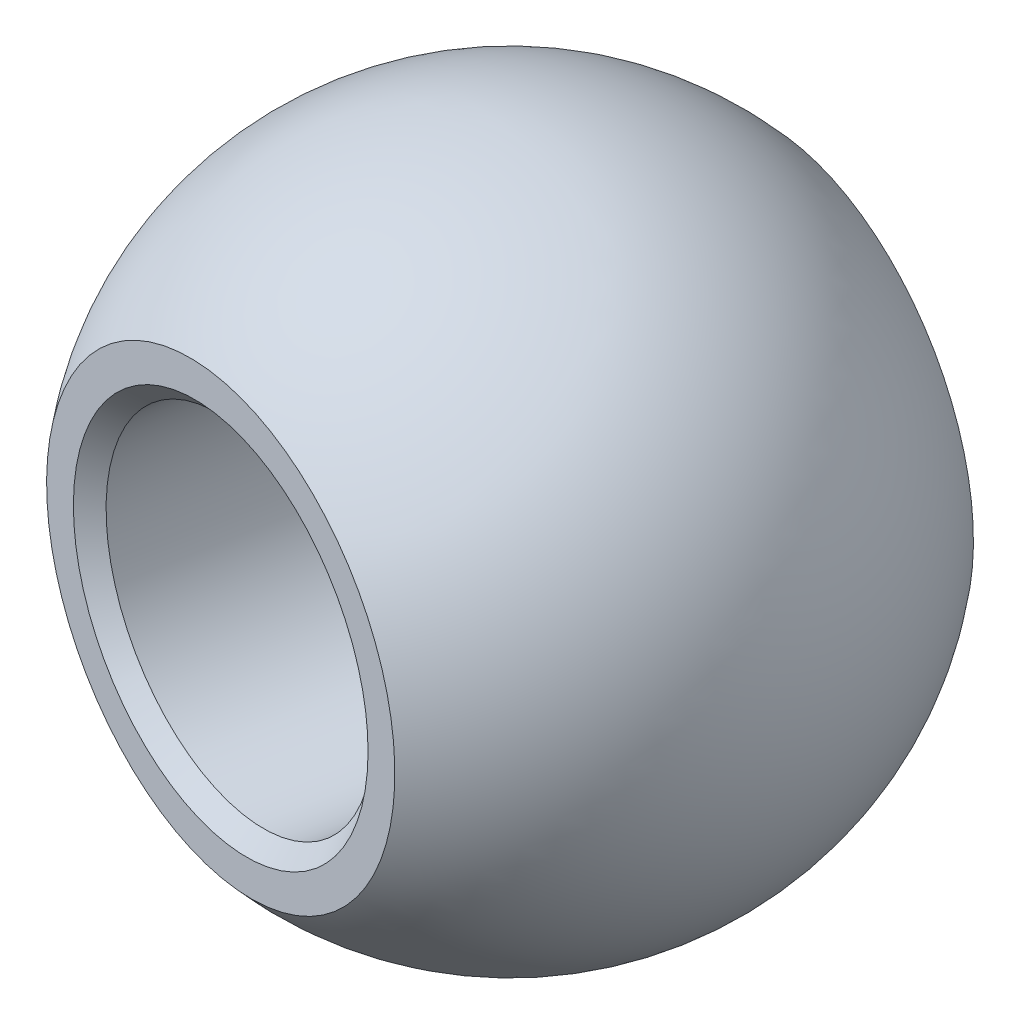
ISO-10303-21;
HEADER;
FILE_DESCRIPTION(('STEP AP214'),'2;1');
FILE_NAME('part.step','',(''),(''),'','','');
FILE_SCHEMA(('AUTOMOTIVE_DESIGN { 1 0 10303 214 1 1 1 1 }'));
ENDSEC;
DATA;
#1=APPLICATION_CONTEXT('core data for automotive mechanical design processes');
#2=APPLICATION_PROTOCOL_DEFINITION('international standard','automotive_design',2000,#1);
#3=PRODUCT_CONTEXT('',#1,'mechanical');
#4=PRODUCT('Part','Part','',(#3));
#5=PRODUCT_RELATED_PRODUCT_CATEGORY('part','',(#4));
#6=PRODUCT_DEFINITION_FORMATION('','',#4);
#7=PRODUCT_DEFINITION_CONTEXT('part definition',#1,'design');
#8=PRODUCT_DEFINITION('design','',#6,#7);
#9=PRODUCT_DEFINITION_SHAPE('','',#8);
#10=(LENGTH_UNIT() NAMED_UNIT(*) SI_UNIT(.MILLI.,.METRE.));
#11=(NAMED_UNIT(*) PLANE_ANGLE_UNIT() SI_UNIT($,.RADIAN.));
#12=(NAMED_UNIT(*) SI_UNIT($,.STERADIAN.) SOLID_ANGLE_UNIT());
#13=UNCERTAINTY_MEASURE_WITH_UNIT(LENGTH_MEASURE(1.E-05),#10,'distance_accuracy_value','');
#14=(GEOMETRIC_REPRESENTATION_CONTEXT(3) GLOBAL_UNCERTAINTY_ASSIGNED_CONTEXT((#13)) GLOBAL_UNIT_ASSIGNED_CONTEXT((#10,
#11,#12)) REPRESENTATION_CONTEXT('',''));
#15=CARTESIAN_POINT('',(0.,0.,0.));
#16=DIRECTION('',(0.,0.,1.));
#17=DIRECTION('',(1.,0.,0.));
#18=AXIS2_PLACEMENT_3D('',#15,#16,#17);
#19=CARTESIAN_POINT('',(0.122184762436604,25.41736829273,-6.94326362928429));
#20=DIRECTION('',(0.177443185252943,0.00114794489750879,-0.984130376642141));
#21=DIRECTION('',(-0.399908128480085,0.913798062770277,-0.07103935003112));
#22=AXIS2_PLACEMENT_3D('',#19,#20,#21);
#23=CONICAL_SURFACE('',#22,4.,0.785398163397449);
#24=CARTESIAN_POINT('',(0.122184762436604,25.41736829273,-6.94326362928429));
#25=DIRECTION('',(-0.177443185252943,-0.00114794489750879,0.984130376642141));
#26=DIRECTION('',(0.399908128480085,-0.913798062770277,0.07103935003112));
#27=AXIS2_PLACEMENT_3D('',#24,#25,#26);
#28=CIRCLE('',#27,4.);
#29=CARTESIAN_POINT('',(-1.47744775148374,29.0725605438111,-7.22742102940877));
#30=VERTEX_POINT('',#29);
#31=CARTESIAN_POINT('',(1.72181727635694,21.7621760416489,-6.65910622915981));
#32=VERTEX_POINT('',#31);
#33=EDGE_CURVE('E11',#30,#32,#28,.T.);
#34=ORIENTED_EDGE('',*,*,#33,.T.);
#35=DIRECTION('',(0.408249029067586,-0.645341087198537,-0.645652856757239));
#36=VECTOR('',#35,1.);
#37=CARTESIAN_POINT('',(1.72181727635694,21.7621760416489,-6.65910622915981));
#38=LINE('',#37,#36);
#39=CARTESIAN_POINT('',(1.95275780185016,21.3971159944998,-7.02434263980421));
#40=VERTEX_POINT('',#39);
#41=EDGE_CURVE('E20',#32,#40,#38,.T.);
#42=ORIENTED_EDGE('',*,*,#41,.T.);
#43=CARTESIAN_POINT('',(0.19316203653778,25.417827470689,-7.33691577994114));
#44=DIRECTION('',(0.177443185252943,0.00114794489750874,-0.984130376642141));
#45=DIRECTION('',(-0.899214882429581,-0.406167185651181,-0.162606311431488));
#46=AXIS2_PLACEMENT_3D('',#43,#44,#45);
#47=CIRCLE('',#46,4.4);
#48=CARTESIAN_POINT('',(-1.5664337287746,29.4385389468782,-7.64948892007807));
#49=VERTEX_POINT('',#48);
#50=EDGE_CURVE('E94',#40,#49,#47,.T.);
#51=ORIENTED_EDGE('',*,*,#50,.T.);
#52=CARTESIAN_POINT('',(0.19316203653778,25.417827470689,-7.33691577994114));
#53=DIRECTION('',(0.177443185252943,0.00114794489750874,-0.984130376642141));
#54=DIRECTION('',(-0.899214882429581,-0.406167185651181,-0.162606311431488));
#55=AXIS2_PLACEMENT_3D('',#52,#53,#54);
#56=CIRCLE('',#55,4.4);
#57=EDGE_CURVE('E96',#49,#40,#56,.T.);
#58=ORIENTED_EDGE('',*,*,#57,.T.);
#59=ORIENTED_EDGE('',*,*,#41,.F.);
#60=CARTESIAN_POINT('',(0.122184762436604,25.41736829273,-6.94326362928429));
#61=DIRECTION('',(-0.177443185252943,-0.00114794489750879,0.984130376642141));
#62=DIRECTION('',(0.399908128480085,-0.913798062770277,0.07103935003112));
#63=AXIS2_PLACEMENT_3D('',#60,#61,#62);
#64=CIRCLE('',#63,4.);
#65=EDGE_CURVE('E39',#32,#30,#64,.T.);
#66=ORIENTED_EDGE('',*,*,#65,.T.);
#67=EDGE_LOOP('',(#34,#42,#51,#58,#59,#66));
#68=FACE_BOUND('',#67,.T.);
#69=ADVANCED_FACE('F16',(#68),#23,.F.);
#70=CARTESIAN_POINT('',(-1.93615618649754,25.4040521319189,4.47264873976455));
#71=DIRECTION('',(-0.177443185252943,-0.00114794489750879,0.984130376642141));
#72=DIRECTION('',(0.399908128480085,-0.913798062770277,0.07103935003112));
#73=AXIS2_PLACEMENT_3D('',#70,#71,#72);
#74=CONICAL_SURFACE('',#73,4.4,0.785398163397444);
#75=CARTESIAN_POINT('',(-1.86517891239636,25.4045113098779,4.07899658910769));
#76=DIRECTION('',(0.177443185252943,0.00114794489750879,-0.984130376642141));
#77=DIRECTION('',(-0.399908128480085,0.913798062770277,-0.07103935003112));
#78=AXIS2_PLACEMENT_3D('',#75,#76,#77);
#79=CIRCLE('',#78,4.);
#80=CARTESIAN_POINT('',(-0.265546398476021,21.7493190587968,4.36315398923217));
#81=VERTEX_POINT('',#80);
#82=CARTESIAN_POINT('',(-3.46481142631671,29.059703560959,3.79483918898321));
#83=VERTEX_POINT('',#82);
#84=EDGE_CURVE('E107',#81,#83,#79,.T.);
#85=ORIENTED_EDGE('',*,*,#84,.T.);
#86=DIRECTION('',(-0.408249029067586,0.645341087198533,0.645652856757243));
#87=VECTOR('',#86,1.);
#88=CARTESIAN_POINT('',(-3.69575195180991,29.4247636081081,4.16007559962762));
#89=LINE('',#88,#87);
#90=CARTESIAN_POINT('',(-3.69575195180991,29.4247636081081,4.16007559962762));
#91=VERTEX_POINT('',#90);
#92=EDGE_CURVE('E128',#83,#91,#89,.T.);
#93=ORIENTED_EDGE('',*,*,#92,.T.);
#94=CARTESIAN_POINT('',(-1.93615618649754,25.4040521319189,4.47264873976455));
#95=DIRECTION('',(-0.177443185252943,-0.00114794489750884,0.984130376642141));
#96=DIRECTION('',(0.899214882429581,0.406167185651181,0.162606311431488));
#97=AXIS2_PLACEMENT_3D('',#94,#95,#96);
#98=CIRCLE('',#97,4.4);
#99=CARTESIAN_POINT('',(-0.176560421185166,21.3833406557297,4.78522187990148));
#100=VERTEX_POINT('',#99);
#101=EDGE_CURVE('E131',#91,#100,#98,.T.);
#102=ORIENTED_EDGE('',*,*,#101,.T.);
#103=CARTESIAN_POINT('',(-1.93615618649754,25.4040521319189,4.47264873976455));
#104=DIRECTION('',(-0.177443185252943,-0.00114794489750884,0.984130376642141));
#105=DIRECTION('',(0.899214882429581,0.406167185651181,0.162606311431488));
#106=AXIS2_PLACEMENT_3D('',#103,#104,#105);
#107=CIRCLE('',#106,4.4);
#108=EDGE_CURVE('E115',#100,#91,#107,.T.);
#109=ORIENTED_EDGE('',*,*,#108,.T.);
#110=ORIENTED_EDGE('',*,*,#92,.F.);
#111=CARTESIAN_POINT('',(-1.86517891239636,25.4045113098779,4.07899658910769));
#112=DIRECTION('',(0.177443185252943,0.00114794489750879,-0.984130376642141));
#113=DIRECTION('',(-0.399908128480085,0.913798062770277,-0.07103935003112));
#114=AXIS2_PLACEMENT_3D('',#111,#112,#113);
#115=CIRCLE('',#114,4.);
#116=EDGE_CURVE('E112',#83,#81,#115,.T.);
#117=ORIENTED_EDGE('',*,*,#116,.T.);
#118=EDGE_LOOP('',(#85,#93,#102,#109,#110,#117));
#119=FACE_BOUND('',#118,.T.);
#120=ADVANCED_FACE('F183',(#119),#74,.F.);
#121=CARTESIAN_POINT('',(-1.93615618649754,25.4040521319189,4.47264873976455));
#122=DIRECTION('',(-0.177443185252943,-0.00114794489750879,0.984130376642141));
#123=DIRECTION('',(-0.399908128480085,0.913798062770277,-0.07103935003112));
#124=AXIS2_PLACEMENT_3D('',#121,#122,#123);
#125=CYLINDRICAL_SURFACE('',#124,4.);
#126=ORIENTED_EDGE('',*,*,#33,.F.);
#127=ORIENTED_EDGE('',*,*,#65,.F.);
#128=DIRECTION('',(-0.177443185252943,-0.00114794489750879,0.984130376642141));
#129=VECTOR('',#128,1.);
#130=CARTESIAN_POINT('',(-0.336523672577201,21.7488598808378,4.75680613988903));
#131=LINE('',#130,#129);
#132=EDGE_CURVE('E116',#32,#81,#131,.T.);
#133=ORIENTED_EDGE('',*,*,#132,.T.);
#134=ORIENTED_EDGE('',*,*,#116,.F.);
#135=ORIENTED_EDGE('',*,*,#84,.F.);
#136=ORIENTED_EDGE('',*,*,#132,.F.);
#137=EDGE_LOOP('',(#126,#127,#133,#134,#135,#136));
#138=FACE_BOUND('',#137,.T.);
#139=ADVANCED_FACE('F188',(#138),#125,.F.);
#140=CARTESIAN_POINT('',(-0.871497074979879,25.4109398013039,-1.4321335200883));
#141=DIRECTION('',(-0.177443185252943,-0.0011479448975089,0.984130376642141));
#142=DIRECTION('',(0.399908128480086,-0.913798062770277,0.07103935003112));
#143=AXIS2_PLACEMENT_3D('',#140,#141,#142);
#144=SPHERICAL_SURFACE('',#143,7.94);
#145=CARTESIAN_POINT('',(-1.93615618649754,25.4040521319189,4.47264873976455));
#146=DIRECTION('',(0.177443185252943,0.00114794489750884,-0.984130376642141));
#147=DIRECTION('',(0.899214882429581,0.406167185651181,0.162606311431488));
#148=AXIS2_PLACEMENT_3D('',#145,#146,#147);
#149=CIRCLE('',#148,5.20034614232552);
#150=CARTESIAN_POINT('',(-6.61238483146189,23.2918421748786,3.62703963539403));
#151=VERTEX_POINT('',#150);
#152=CARTESIAN_POINT('',(-4.01581687972357,30.1561183625108,4.1032195298769));
#153=VERTEX_POINT('',#152);
#154=EDGE_CURVE('E117',#151,#153,#149,.T.);
#155=ORIENTED_EDGE('',*,*,#154,.T.);
#156=CARTESIAN_POINT('',(-0.871497074979879,25.4109398013039,-1.4321335200883));
#157=DIRECTION('',(-0.899214882429581,-0.406167185651181,-0.162606311431488));
#158=DIRECTION('',(-0.399908128480086,0.913798062770277,-0.0710393500311201));
#159=AXIS2_PLACEMENT_3D('',#156,#157,#158);
#160=CIRCLE('',#159,7.94);
#161=CARTESIAN_POINT('',(-1.88649865668825,30.1698937012809,-7.70634498982879));
#162=VERTEX_POINT('',#161);
#163=EDGE_CURVE('E121',#153,#162,#160,.T.);
#164=ORIENTED_EDGE('',*,*,#163,.T.);
#165=CARTESIAN_POINT('',(0.19316203653778,25.417827470689,-7.33691577994114));
#166=DIRECTION('',(-0.177443185252943,-0.00114794489750874,0.984130376642141));
#167=DIRECTION('',(-0.899214882429581,-0.406167185651181,-0.162606311431488));
#168=AXIS2_PLACEMENT_3D('',#165,#166,#167);
#169=CIRCLE('',#168,5.20034614232552);
#170=CARTESIAN_POINT('',(4.86939068150213,27.5300374277293,-6.49130667557062));
#171=VERTEX_POINT('',#170);
#172=EDGE_CURVE('E76',#162,#171,#169,.T.);
#173=ORIENTED_EDGE('',*,*,#172,.T.);
#174=CARTESIAN_POINT('',(0.19316203653778,25.417827470689,-7.33691577994114));
#175=DIRECTION('',(-0.177443185252943,-0.00114794489750874,0.984130376642141));
#176=DIRECTION('',(-0.899214882429581,-0.406167185651181,-0.162606311431488));
#177=AXIS2_PLACEMENT_3D('',#174,#175,#176);
#178=CIRCLE('',#177,5.20034614232552);
#179=EDGE_CURVE('E122',#171,#162,#178,.T.);
#180=ORIENTED_EDGE('',*,*,#179,.T.);
#181=ORIENTED_EDGE('',*,*,#163,.F.);
#182=CARTESIAN_POINT('',(-1.93615618649754,25.4040521319189,4.47264873976455));
#183=DIRECTION('',(0.177443185252943,0.00114794489750884,-0.984130376642141));
#184=DIRECTION('',(0.899214882429581,0.406167185651181,0.162606311431488));
#185=AXIS2_PLACEMENT_3D('',#182,#183,#184);
#186=CIRCLE('',#185,5.20034614232552);
#187=EDGE_CURVE('E125',#153,#151,#186,.T.);
#188=ORIENTED_EDGE('',*,*,#187,.T.);
#189=EDGE_LOOP('',(#155,#164,#173,#180,#181,#188));
#190=FACE_BOUND('',#189,.T.);
#191=ADVANCED_FACE('F194',(#190),#144,.T.);
#192=CARTESIAN_POINT('',(-5.36162560115036,10.7332140820003,-8.35559822552023));
#193=DIRECTION('',(0.177443185252943,0.00114794489750874,-0.984130376642141));
#194=DIRECTION('',(0.399908128480085,-0.913798062770277,0.07103935003112));
#195=AXIS2_PLACEMENT_3D('',#192,#193,#194);
#196=PLANE('',#195);
#197=ORIENTED_EDGE('',*,*,#179,.F.);
#198=ORIENTED_EDGE('',*,*,#172,.F.);
#199=EDGE_LOOP('',(#197,#198));
#200=FACE_BOUND('',#199,.T.);
#201=ORIENTED_EDGE('',*,*,#57,.F.);
#202=ORIENTED_EDGE('',*,*,#50,.F.);
#203=EDGE_LOOP('',(#201,#202));
#204=FACE_BOUND('',#203,.T.);
#205=ADVANCED_FACE('F100',(#200,#204),#196,.T.);
#206=CARTESIAN_POINT('',(-7.49094382418568,10.7194387432302,3.45396629418546));
#207=DIRECTION('',(-0.177443185252943,-0.00114794489750884,0.984130376642141));
#208=DIRECTION('',(-0.399908128480085,0.913798062770277,-0.07103935003112));
#209=AXIS2_PLACEMENT_3D('',#206,#207,#208);
#210=PLANE('',#209);
#211=ORIENTED_EDGE('',*,*,#154,.F.);
#212=ORIENTED_EDGE('',*,*,#187,.F.);
#213=EDGE_LOOP('',(#211,#212));
#214=FACE_BOUND('',#213,.T.);
#215=ORIENTED_EDGE('',*,*,#108,.F.);
#216=ORIENTED_EDGE('',*,*,#101,.F.);
#217=EDGE_LOOP('',(#215,#216));
#218=FACE_BOUND('',#217,.T.);
#219=ADVANCED_FACE('F18',(#214,#218),#210,.T.);
#220=CLOSED_SHELL('',(#69,#120,#139,#191,#205,#219));
#221=MANIFOLD_SOLID_BREP('B1',#220);
#222=ADVANCED_BREP_SHAPE_REPRESENTATION('',(#18,#221),#14);
#223=SHAPE_DEFINITION_REPRESENTATION(#9,#222);
ENDSEC;
END-ISO-10303-21;
